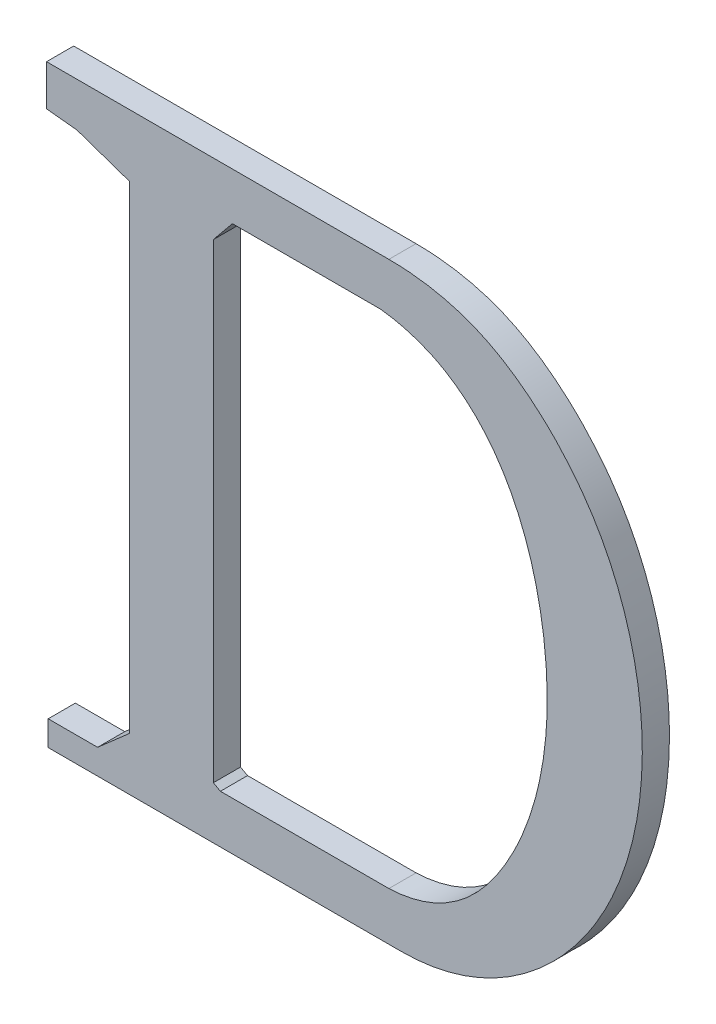
ISO-10303-21;
HEADER;
FILE_DESCRIPTION(('STEP AP214'),'2;1');
FILE_NAME('part.step','',(''),(''),'','','');
FILE_SCHEMA(('AUTOMOTIVE_DESIGN { 1 0 10303 214 1 1 1 1 }'));
ENDSEC;
DATA;
#1=APPLICATION_CONTEXT('core data for automotive mechanical design processes');
#2=APPLICATION_PROTOCOL_DEFINITION('international standard','automotive_design',2000,#1);
#3=PRODUCT_CONTEXT('',#1,'mechanical');
#4=PRODUCT('Part','Part','',(#3));
#5=PRODUCT_RELATED_PRODUCT_CATEGORY('part','',(#4));
#6=PRODUCT_DEFINITION_FORMATION('','',#4);
#7=PRODUCT_DEFINITION_CONTEXT('part definition',#1,'design');
#8=PRODUCT_DEFINITION('design','',#6,#7);
#9=PRODUCT_DEFINITION_SHAPE('','',#8);
#10=(LENGTH_UNIT() NAMED_UNIT(*) SI_UNIT(.MILLI.,.METRE.));
#11=(NAMED_UNIT(*) PLANE_ANGLE_UNIT() SI_UNIT($,.RADIAN.));
#12=(NAMED_UNIT(*) SI_UNIT($,.STERADIAN.) SOLID_ANGLE_UNIT());
#13=UNCERTAINTY_MEASURE_WITH_UNIT(LENGTH_MEASURE(1.E-05),#10,'distance_accuracy_value','');
#14=(GEOMETRIC_REPRESENTATION_CONTEXT(3) GLOBAL_UNCERTAINTY_ASSIGNED_CONTEXT((#13)) GLOBAL_UNIT_ASSIGNED_CONTEXT((#10,
#11,#12)) REPRESENTATION_CONTEXT('',''));
#15=CARTESIAN_POINT('',(0.,0.,0.));
#16=DIRECTION('',(0.,0.,1.));
#17=DIRECTION('',(1.,0.,0.));
#18=AXIS2_PLACEMENT_3D('',#15,#16,#17);
#19=CARTESIAN_POINT('',(0.,0.,0.05));
#20=DIRECTION('',(0.,0.,1.));
#21=DIRECTION('',(1.,0.,0.));
#22=AXIS2_PLACEMENT_3D('',#19,#20,#21);
#23=PLANE('',#22);
#24=DIRECTION('',(0.,1.,0.));
#25=VECTOR('',#24,1.);
#26=CARTESIAN_POINT('',(2.25679,-0.204724,0.05));
#27=LINE('',#26,#25);
#28=CARTESIAN_POINT('',(2.25679,0.661162,0.05));
#29=VERTEX_POINT('',#28);
#30=CARTESIAN_POINT('',(2.25679,-0.204724,0.05));
#31=VERTEX_POINT('',#30);
#32=EDGE_CURVE('E256',#29,#31,#27,.F.);
#33=ORIENTED_EDGE('',*,*,#32,.F.);
#34=DIRECTION('',(0.632488744875069,0.774569549883262,0.));
#35=VECTOR('',#34,1.);
#36=CARTESIAN_POINT('',(2.25679,0.661162,0.05));
#37=LINE('',#36,#35);
#38=CARTESIAN_POINT('',(2.291842,0.704088,0.05));
#39=VERTEX_POINT('',#38);
#40=EDGE_CURVE('E169',#39,#29,#37,.F.);
#41=ORIENTED_EDGE('',*,*,#40,.F.);
#42=DIRECTION('',(1.,0.,0.));
#43=VECTOR('',#42,1.);
#44=CARTESIAN_POINT('',(2.291842,0.704088,0.05));
#45=LINE('',#44,#43);
#46=CARTESIAN_POINT('',(2.56489199999966,0.704088000000059,0.05));
#47=VERTEX_POINT('',#46);
#48=EDGE_CURVE('E245',#47,#39,#45,.F.);
#49=ORIENTED_EDGE('',*,*,#48,.F.);
#50=CARTESIAN_POINT('',(2.579878,-0.211836000000042,0.05));
#51=CARTESIAN_POINT('',(2.59270405725341,-0.211378179546537,0.05));
#52=CARTESIAN_POINT('',(2.60551222075906,-0.209871885968661,0.05));
#53=CARTESIAN_POINT('',(2.63063931178318,-0.204755190453759,0.05));
#54=CARTESIAN_POINT('',(2.64296014726019,-0.201154094240938,0.05));
#55=CARTESIAN_POINT('',(2.66681818194975,-0.19182163463833,0.05));
#56=CARTESIAN_POINT('',(2.67835268512661,-0.186083339394163,0.05));
#57=CARTESIAN_POINT('',(2.70029341804385,-0.172779544921037,0.05));
#58=CARTESIAN_POINT('',(2.71069980557258,-0.165214301704397,0.05));
#59=CARTESIAN_POINT('',(2.73396801022546,-0.145543903185185,0.05));
#60=CARTESIAN_POINT('',(2.74628598550045,-0.132800404147166,0.05));
#61=CARTESIAN_POINT('',(2.76881776027124,-0.105526698379534,0.05));
#62=CARTESIAN_POINT('',(2.77902079535795,-0.0909879247064866,0.05));
#63=CARTESIAN_POINT('',(2.79616194184674,-0.0632656785516099,0.05));
#64=CARTESIAN_POINT('',(2.80336123893922,-0.0502397144528223,0.05));
#65=CARTESIAN_POINT('',(2.81667590375223,-0.0236421636391551,0.05));
#66=CARTESIAN_POINT('',(2.82279078288767,-0.0100703343457068,0.05));
#67=CARTESIAN_POINT('',(2.83943365306022,0.031273878432151,0.05));
#68=CARTESIAN_POINT('',(2.84829543356656,0.0597337911450507,0.05));
#69=CARTESIAN_POINT('',(2.86190337257059,0.118439893695758,0.05));
#70=CARTESIAN_POINT('',(2.86652497963052,0.148713877930418,0.05));
#71=CARTESIAN_POINT('',(2.87156741125946,0.209673996898516,0.05));
#72=CARTESIAN_POINT('',(2.87197793402499,0.240360958565274,0.05));
#73=CARTESIAN_POINT('',(2.86954013515845,0.289481838210722,0.05));
#74=CARTESIAN_POINT('',(2.86791022801706,0.307987207923261,0.05));
#75=CARTESIAN_POINT('',(2.8633194842924,0.344832646171001,0.05));
#76=CARTESIAN_POINT('',(2.86035800239188,0.363172630154654,0.05));
#77=CARTESIAN_POINT('',(2.84933386963922,0.417701102317451,0.05));
#78=CARTESIAN_POINT('',(2.83912581941203,0.453531529576088,0.05));
#79=CARTESIAN_POINT('',(2.81775955146486,0.50638321523503,0.05));
#80=CARTESIAN_POINT('',(2.80920744507614,0.524462622904349,0.05));
#81=CARTESIAN_POINT('',(2.7896303952468,0.559231499217572,0.05));
#82=CARTESIAN_POINT('',(2.77860984968366,0.575923368320503,0.05));
#83=CARTESIAN_POINT('',(2.7556710752392,0.604900256039021,0.05));
#84=CARTESIAN_POINT('',(2.74411978855582,0.617472760386937,0.05));
#85=CARTESIAN_POINT('',(2.71906691050355,0.640504672502657,0.05));
#86=CARTESIAN_POINT('',(2.70556699929959,0.650965882246984,0.05));
#87=CARTESIAN_POINT('',(2.67683844338449,0.669319736273249,0.05));
#88=CARTESIAN_POINT('',(2.66160290241437,0.677201615519794,0.05));
#89=CARTESIAN_POINT('',(2.62996215000533,0.690103802332504,0.05));
#90=CARTESIAN_POINT('',(2.61355674412275,0.695123632943444,0.05));
#91=CARTESIAN_POINT('',(2.59158863320416,0.69992417673529,0.05));
#92=CARTESIAN_POINT('',(2.58626941404877,0.700942055288227,0.05));
#93=CARTESIAN_POINT('',(2.57560292359691,0.702710547614795,0.05));
#94=CARTESIAN_POINT('',(2.57025578339688,0.703461949952957,0.05));
#95=CARTESIAN_POINT('',(2.56489199999923,0.704088000000115,0.05));
#96=B_SPLINE_CURVE_WITH_KNOTS('',3,(#50,#51,#52,#53,#54,#55,#56,#57,#58,#59,#60,#61,#62,#63,#64,
#65,#66,#67,#68,#69,#70,#71,#72,#73,#74,#75,#76,#77,#78,#79,#80,#81,#82,#83,#84,#85,#86,#87,#88,
#89,#90,#91,#92,#93,#94,#95),.UNSPECIFIED.,.F.,.F.,(4,2,2,2,2,2,2,2,2,2,2,2,2,2,2,2,2,2,2,2,2,2,
4),(0.,0.0384927831424705,0.0768158619811147,0.115264337089049,0.153707427491179,
0.206575510072063,0.259706403779363,0.304301583792309,0.348916805421521,0.437943573629923,
0.529508726595082,0.621297827085596,0.676979625728418,0.732688438415223,0.843708611321038,
0.903562853257194,0.963311292759999,1.01432243820239,1.06528986010274,1.11646736325322,
1.16765339255099,1.1838965895315,1.20009130997878),.UNSPECIFIED.);
#97=CARTESIAN_POINT('',(2.579878,-0.211836000000021,0.05));
#98=VERTEX_POINT('',#97);
#99=EDGE_CURVE('E201',#98,#47,#96,.T.);
#100=ORIENTED_EDGE('',*,*,#99,.F.);
#101=DIRECTION('',(1.,0.,0.));
#102=VECTOR('',#101,1.);
#103=CARTESIAN_POINT('',(2.579878,-0.211836,0.05));
#104=LINE('',#103,#102);
#105=CARTESIAN_POINT('',(2.269744,-0.211836,0.05));
#106=VERTEX_POINT('',#105);
#107=EDGE_CURVE('E242',#106,#98,#104,.T.);
#108=ORIENTED_EDGE('',*,*,#107,.F.);
#109=DIRECTION('',(-0.876578550779603,0.481258812192702,0.));
#110=VECTOR('',#109,1.);
#111=CARTESIAN_POINT('',(2.269744,-0.211836,0.05));
#112=LINE('',#111,#110);
#113=EDGE_CURVE('E262',#31,#106,#112,.F.);
#114=ORIENTED_EDGE('',*,*,#113,.F.);
#115=EDGE_LOOP('',(#33,#41,#49,#100,#108,#114));
#116=FACE_BOUND('',#115,.T.);
#117=DIRECTION('',(0.,1.,0.));
#118=VECTOR('',#117,1.);
#119=CARTESIAN_POINT('',(1.949704,0.79121,0.05));
#120=LINE('',#119,#118);
#121=CARTESIAN_POINT('',(1.949704,0.716026,0.05));
#122=VERTEX_POINT('',#121);
#123=CARTESIAN_POINT('',(1.949704,0.79121,0.05));
#124=VERTEX_POINT('',#123);
#125=EDGE_CURVE('E156',#122,#124,#120,.T.);
#126=ORIENTED_EDGE('',*,*,#125,.F.);
#127=DIRECTION('',(0.994628066608391,-0.103513328199099,0.));
#128=VECTOR('',#127,1.);
#129=CARTESIAN_POINT('',(1.949704,0.716026,0.05));
#130=LINE('',#129,#128);
#131=CARTESIAN_POINT('',(2.005838,0.710183999999999,0.05));
#132=VERTEX_POINT('',#131);
#133=EDGE_CURVE('E322',#132,#122,#130,.F.);
#134=ORIENTED_EDGE('',*,*,#133,.F.);
#135=DIRECTION('',(0.945100283555715,-0.326780437026005,0.));
#136=VECTOR('',#135,1.);
#137=CARTESIAN_POINT('',(2.005838,0.710184,0.05));
#138=LINE('',#137,#136);
#139=CARTESIAN_POINT('',(2.102866,0.676635335593207,0.05));
#140=VERTEX_POINT('',#139);
#141=EDGE_CURVE('E324',#140,#132,#138,.F.);
#142=ORIENTED_EDGE('',*,*,#141,.F.);
#143=DIRECTION('',(0.,1.,0.));
#144=VECTOR('',#143,1.);
#145=CARTESIAN_POINT('',(2.102866,0.6766353355932,0.05));
#146=LINE('',#145,#144);
#147=CARTESIAN_POINT('',(2.102866,-0.2028639384615,0.05));
#148=VERTEX_POINT('',#147);
#149=EDGE_CURVE('E347',#148,#140,#146,.T.);
#150=ORIENTED_EDGE('',*,*,#149,.F.);
#151=DIRECTION('',(-0.751859704857293,-0.659323125797894,0.));
#152=VECTOR('',#151,1.);
#153=CARTESIAN_POINT('',(2.102866,-0.2028639384615,0.05));
#154=LINE('',#153,#152);
#155=CARTESIAN_POINT('',(2.04368399999999,-0.254761999999992,0.05));
#156=VERTEX_POINT('',#155);
#157=EDGE_CURVE('E342',#156,#148,#154,.F.);
#158=ORIENTED_EDGE('',*,*,#157,.F.);
#159=DIRECTION('',(1.,0.,0.));
#160=VECTOR('',#159,1.);
#161=CARTESIAN_POINT('',(2.043684,-0.254762,0.05));
#162=LINE('',#161,#160);
#163=CARTESIAN_POINT('',(1.952752,-0.254762,0.05));
#164=VERTEX_POINT('',#163);
#165=EDGE_CURVE('E337',#164,#156,#162,.T.);
#166=ORIENTED_EDGE('',*,*,#165,.F.);
#167=DIRECTION('',(0.,1.,0.));
#168=VECTOR('',#167,1.);
#169=CARTESIAN_POINT('',(1.952752,-0.254762,0.05));
#170=LINE('',#169,#168);
#171=CARTESIAN_POINT('',(1.952752,-0.300736,0.05));
#172=VERTEX_POINT('',#171);
#173=EDGE_CURVE('E332',#172,#164,#170,.T.);
#174=ORIENTED_EDGE('',*,*,#173,.F.);
#175=DIRECTION('',(1.,0.,0.));
#176=VECTOR('',#175,1.);
#177=CARTESIAN_POINT('',(1.952752,-0.300736,0.05));
#178=LINE('',#177,#176);
#179=CARTESIAN_POINT('',(2.602738,-0.300735999999985,0.05));
#180=VERTEX_POINT('',#179);
#181=EDGE_CURVE('E131',#180,#172,#178,.F.);
#182=ORIENTED_EDGE('',*,*,#181,.F.);
#183=CARTESIAN_POINT('',(2.602738,-0.30073599999997,0.05));
#184=CARTESIAN_POINT('',(2.623562995287,-0.300761992288105,0.05));
#185=CARTESIAN_POINT('',(2.64436086946251,-0.298884113560386,0.05));
#186=CARTESIAN_POINT('',(2.68516838250024,-0.291607859565774,0.05));
#187=CARTESIAN_POINT('',(2.70518289958912,-0.286237022724266,0.05));
#188=CARTESIAN_POINT('',(2.74400737886422,-0.272263101091833,0.05));
#189=CARTESIAN_POINT('',(2.76281883053643,-0.263664107365345,0.05));
#190=CARTESIAN_POINT('',(2.7989623383027,-0.243726543156044,0.05));
#191=CARTESIAN_POINT('',(2.81629066500049,-0.232381326124191,0.05));
#192=CARTESIAN_POINT('',(2.85515606419696,-0.203032091320414,0.05));
#193=CARTESIAN_POINT('',(2.87599045632696,-0.184096241178142,0.05));
#194=CARTESIAN_POINT('',(2.91427686923892,-0.14307804316321,0.05));
#195=CARTESIAN_POINT('',(2.93172621216421,-0.120993227963387,0.05));
#196=CARTESIAN_POINT('',(2.96310547375458,-0.0742195368281475,0.05));
#197=CARTESIAN_POINT('',(2.97700805431244,-0.0495123962140172,0.05));
#198=CARTESIAN_POINT('',(3.00103705311622,0.00167925599964491,0.05));
#199=CARTESIAN_POINT('',(3.01116090978586,0.0281649589774403,0.05));
#200=CARTESIAN_POINT('',(3.02868525317362,0.0859043435674079,0.05));
#201=CARTESIAN_POINT('',(3.03554266232821,0.117322906383205,0.05));
#202=CARTESIAN_POINT('',(3.04450115407727,0.180862328737189,0.05));
#203=CARTESIAN_POINT('',(3.04659453165181,0.212984241250375,0.05));
#204=CARTESIAN_POINT('',(3.04607810686378,0.280870017238335,0.05));
#205=CARTESIAN_POINT('',(3.04290404049229,0.31663096905724,0.05));
#206=CARTESIAN_POINT('',(3.03081239101497,0.387123345976574,0.05));
#207=CARTESIAN_POINT('',(3.02190094971894,0.421855830503555,0.05));
#208=CARTESIAN_POINT('',(2.99782219850063,0.490250138933382,0.05));
#209=CARTESIAN_POINT('',(2.98248978076084,0.523856351051291,0.05));
#210=CARTESIAN_POINT('',(2.95455813984039,0.571361300337074,0.05));
#211=CARTESIAN_POINT('',(2.94440998248923,0.58672923078394,0.05));
#212=CARTESIAN_POINT('',(2.92258415593713,0.616342055123154,0.05));
#213=CARTESIAN_POINT('',(2.91090658164379,0.630587018613142,0.05));
#214=CARTESIAN_POINT('',(2.88983076696257,0.653794182272005,0.05));
#215=CARTESIAN_POINT('',(2.88077881888031,0.66307346564359,0.05));
#216=CARTESIAN_POINT('',(2.86205328393399,0.680973471179745,0.05));
#217=CARTESIAN_POINT('',(2.85237971462289,0.689594211924823,0.05));
#218=CARTESIAN_POINT('',(2.82246277122565,0.714237917896754,0.05));
#219=CARTESIAN_POINT('',(2.80123626266474,0.72914000212287,0.05));
#220=CARTESIAN_POINT('',(2.76923474532928,0.747173507405283,0.05));
#221=CARTESIAN_POINT('',(2.75947772028502,0.752142371188585,0.05));
#222=CARTESIAN_POINT('',(2.73954229709766,0.761148196098751,0.05));
#223=CARTESIAN_POINT('',(2.72936391333282,0.765185188993539,0.05));
#224=CARTESIAN_POINT('',(2.69833385418089,0.775927439323632,0.05));
#225=CARTESIAN_POINT('',(2.67699432402221,0.781260031948526,0.05));
#226=CARTESIAN_POINT('',(2.64290992911732,0.787057535272704,0.05));
#227=CARTESIAN_POINT('',(2.63033025949132,0.788626638654855,0.05));
#228=CARTESIAN_POINT('',(2.60512784802284,0.790698772849745,0.05));
#229=CARTESIAN_POINT('',(2.59250542025063,0.791205589351436,0.05));
#230=CARTESIAN_POINT('',(2.579878,0.791209999999999,0.05));
#231=B_SPLINE_CURVE_WITH_KNOTS('',3,(#183,#184,#185,#186,#187,#188,#189,#190,#191,#192,#193,
#194,#195,#196,#197,#198,#199,#200,#201,#202,#203,#204,#205,#206,#207,#208,#209,#210,#211,#212,
#213,#214,#215,#216,#217,#218,#219,#220,#221,#222,#223,#224,#225,#226,#227,#228,#229,#230),
.UNSPECIFIED.,.F.,.F.,(4,2,2,2,2,2,2,2,2,2,2,2,2,2,2,2,2,2,2,2,2,2,2,4),(0.,0.0623498409178476,
0.124213980088461,0.185999981651488,0.247937042862017,0.33196076441486,0.416050687091103,
0.500770414588374,0.585547469267111,0.681627848218424,0.777863510924983,0.885086681953342,
0.99219526193235,1.10224581160885,1.15740616369909,1.2125630944479,1.25141940087842,
1.29027461058914,1.36759605680743,1.40040465181357,1.43321212819383,1.49885095844088,
1.53684667323706,1.57470675024911),.UNSPECIFIED.);
#232=CARTESIAN_POINT('',(2.579878,0.791209999999999,0.05));
#233=VERTEX_POINT('',#232);
#234=EDGE_CURVE('E21',#180,#233,#231,.T.);
#235=ORIENTED_EDGE('',*,*,#234,.T.);
#236=DIRECTION('',(1.,0.,0.));
#237=VECTOR('',#236,1.);
#238=CARTESIAN_POINT('',(2.579878,0.79121,0.05));
#239=LINE('',#238,#237);
#240=EDGE_CURVE('E137',#124,#233,#239,.T.);
#241=ORIENTED_EDGE('',*,*,#240,.F.);
#242=EDGE_LOOP('',(#126,#134,#142,#150,#158,#166,#174,#182,#235,#241));
#243=FACE_BOUND('',#242,.T.);
#244=ADVANCED_FACE('F17',(#116,#243),#23,.T.);
#245=CARTESIAN_POINT('',(1.949704,0.716026,0.));
#246=DIRECTION('',(-0.103513328199099,-0.994628066608391,0.));
#247=DIRECTION('',(0.994628066608391,-0.103513328199099,0.));
#248=AXIS2_PLACEMENT_3D('',#245,#246,#247);
#249=PLANE('',#248);
#250=DIRECTION('',(0.,0.,1.));
#251=VECTOR('',#250,1.);
#252=CARTESIAN_POINT('',(1.949704,0.716026,0.));
#253=LINE('',#252,#251);
#254=CARTESIAN_POINT('',(1.949704,0.716026,0.));
#255=VERTEX_POINT('',#254);
#256=EDGE_CURVE('E153',#255,#122,#253,.T.);
#257=ORIENTED_EDGE('',*,*,#256,.F.);
#258=DIRECTION('',(0.994628066608395,-0.103513328199063,0.));
#259=VECTOR('',#258,1.);
#260=CARTESIAN_POINT('',(1.949704,0.716026,0.));
#261=LINE('',#260,#259);
#262=CARTESIAN_POINT('',(2.005838,0.710184,0.));
#263=VERTEX_POINT('',#262);
#264=EDGE_CURVE('E304',#255,#263,#261,.T.);
#265=ORIENTED_EDGE('',*,*,#264,.T.);
#266=DIRECTION('',(0.,0.,1.));
#267=VECTOR('',#266,1.);
#268=CARTESIAN_POINT('',(2.005838,0.710184,0.));
#269=LINE('',#268,#267);
#270=EDGE_CURVE('E349',#132,#263,#269,.F.);
#271=ORIENTED_EDGE('',*,*,#270,.F.);
#272=ORIENTED_EDGE('',*,*,#133,.T.);
#273=EDGE_LOOP('',(#257,#265,#271,#272));
#274=FACE_BOUND('',#273,.T.);
#275=ADVANCED_FACE('F381',(#274),#249,.T.);
#276=CARTESIAN_POINT('',(2.005838,0.710184,0.));
#277=DIRECTION('',(-0.326780437026005,-0.945100283555715,0.));
#278=DIRECTION('',(0.945100283555715,-0.326780437026005,0.));
#279=AXIS2_PLACEMENT_3D('',#276,#277,#278);
#280=PLANE('',#279);
#281=ORIENTED_EDGE('',*,*,#270,.T.);
#282=DIRECTION('',(0.945100283555642,-0.326780437026217,0.));
#283=VECTOR('',#282,1.);
#284=CARTESIAN_POINT('',(2.005838,0.710184,0.));
#285=LINE('',#284,#283);
#286=CARTESIAN_POINT('',(2.102866,0.6766353355932,0.));
#287=VERTEX_POINT('',#286);
#288=EDGE_CURVE('E307',#263,#287,#285,.T.);
#289=ORIENTED_EDGE('',*,*,#288,.T.);
#290=DIRECTION('',(0.,0.,1.));
#291=VECTOR('',#290,1.);
#292=CARTESIAN_POINT('',(2.102866,0.6766353355932,0.));
#293=LINE('',#292,#291);
#294=EDGE_CURVE('E344',#140,#287,#293,.F.);
#295=ORIENTED_EDGE('',*,*,#294,.F.);
#296=ORIENTED_EDGE('',*,*,#141,.T.);
#297=EDGE_LOOP('',(#281,#289,#295,#296));
#298=FACE_BOUND('',#297,.T.);
#299=ADVANCED_FACE('F386',(#298),#280,.T.);
#300=CARTESIAN_POINT('',(2.102866,0.6766353355932,0.));
#301=DIRECTION('',(-1.,0.,0.));
#302=DIRECTION('',(0.,0.,1.));
#303=AXIS2_PLACEMENT_3D('',#300,#301,#302);
#304=PLANE('',#303);
#305=ORIENTED_EDGE('',*,*,#294,.T.);
#306=DIRECTION('',(0.,1.,0.));
#307=VECTOR('',#306,1.);
#308=CARTESIAN_POINT('',(2.102866,0.,0.));
#309=LINE('',#308,#307);
#310=CARTESIAN_POINT('',(2.102866,-0.2028639384615,0.));
#311=VERTEX_POINT('',#310);
#312=EDGE_CURVE('E428',#287,#311,#309,.F.);
#313=ORIENTED_EDGE('',*,*,#312,.T.);
#314=DIRECTION('',(0.,0.,1.));
#315=VECTOR('',#314,1.);
#316=CARTESIAN_POINT('',(2.102866,-0.2028639384615,0.));
#317=LINE('',#316,#315);
#318=EDGE_CURVE('E339',#148,#311,#317,.F.);
#319=ORIENTED_EDGE('',*,*,#318,.F.);
#320=ORIENTED_EDGE('',*,*,#149,.T.);
#321=EDGE_LOOP('',(#305,#313,#319,#320));
#322=FACE_BOUND('',#321,.T.);
#323=ADVANCED_FACE('F391',(#322),#304,.T.);
#324=CARTESIAN_POINT('',(2.102866,-0.2028639384615,0.));
#325=DIRECTION('',(-0.659323125797894,0.751859704857293,0.));
#326=DIRECTION('',(-0.751859704857293,-0.659323125797894,0.));
#327=AXIS2_PLACEMENT_3D('',#324,#325,#326);
#328=PLANE('',#327);
#329=ORIENTED_EDGE('',*,*,#318,.T.);
#330=DIRECTION('',(-0.751859704857031,-0.659323125798192,0.));
#331=VECTOR('',#330,1.);
#332=CARTESIAN_POINT('',(2.102866,-0.2028639384615,0.));
#333=LINE('',#332,#331);
#334=CARTESIAN_POINT('',(2.043684,-0.254762,0.));
#335=VERTEX_POINT('',#334);
#336=EDGE_CURVE('E426',#311,#335,#333,.T.);
#337=ORIENTED_EDGE('',*,*,#336,.T.);
#338=DIRECTION('',(0.,0.,1.));
#339=VECTOR('',#338,1.);
#340=CARTESIAN_POINT('',(2.043684,-0.254762,0.));
#341=LINE('',#340,#339);
#342=EDGE_CURVE('E334',#156,#335,#341,.F.);
#343=ORIENTED_EDGE('',*,*,#342,.F.);
#344=ORIENTED_EDGE('',*,*,#157,.T.);
#345=EDGE_LOOP('',(#329,#337,#343,#344));
#346=FACE_BOUND('',#345,.T.);
#347=ADVANCED_FACE('F397',(#346),#328,.T.);
#348=CARTESIAN_POINT('',(2.043684,-0.254762,0.));
#349=DIRECTION('',(0.,1.,0.));
#350=DIRECTION('',(0.,0.,1.));
#351=AXIS2_PLACEMENT_3D('',#348,#349,#350);
#352=PLANE('',#351);
#353=ORIENTED_EDGE('',*,*,#342,.T.);
#354=DIRECTION('',(1.,0.,0.));
#355=VECTOR('',#354,1.);
#356=CARTESIAN_POINT('',(0.,-0.254762,0.));
#357=LINE('',#356,#355);
#358=CARTESIAN_POINT('',(1.952752,-0.254762,0.));
#359=VERTEX_POINT('',#358);
#360=EDGE_CURVE('E422',#335,#359,#357,.F.);
#361=ORIENTED_EDGE('',*,*,#360,.T.);
#362=DIRECTION('',(0.,0.,1.));
#363=VECTOR('',#362,1.);
#364=CARTESIAN_POINT('',(1.952752,-0.254762,0.));
#365=LINE('',#364,#363);
#366=EDGE_CURVE('E329',#164,#359,#365,.F.);
#367=ORIENTED_EDGE('',*,*,#366,.F.);
#368=ORIENTED_EDGE('',*,*,#165,.T.);
#369=EDGE_LOOP('',(#353,#361,#367,#368));
#370=FACE_BOUND('',#369,.T.);
#371=ADVANCED_FACE('F401',(#370),#352,.T.);
#372=CARTESIAN_POINT('',(1.952752,-0.254762,0.));
#373=DIRECTION('',(-1.,0.,0.));
#374=DIRECTION('',(0.,0.,1.));
#375=AXIS2_PLACEMENT_3D('',#372,#373,#374);
#376=PLANE('',#375);
#377=ORIENTED_EDGE('',*,*,#366,.T.);
#378=DIRECTION('',(0.,1.,0.));
#379=VECTOR('',#378,1.);
#380=CARTESIAN_POINT('',(1.952752,0.,0.));
#381=LINE('',#380,#379);
#382=CARTESIAN_POINT('',(1.952752,-0.300736,0.));
#383=VERTEX_POINT('',#382);
#384=EDGE_CURVE('E278',#359,#383,#381,.F.);
#385=ORIENTED_EDGE('',*,*,#384,.T.);
#386=DIRECTION('',(0.,0.,-1.));
#387=VECTOR('',#386,1.);
#388=CARTESIAN_POINT('',(1.952752,-0.300736,0.));
#389=LINE('',#388,#387);
#390=EDGE_CURVE('E328',#172,#383,#389,.T.);
#391=ORIENTED_EDGE('',*,*,#390,.F.);
#392=ORIENTED_EDGE('',*,*,#173,.T.);
#393=EDGE_LOOP('',(#377,#385,#391,#392));
#394=FACE_BOUND('',#393,.T.);
#395=ADVANCED_FACE('F404',(#394),#376,.T.);
#396=CARTESIAN_POINT('',(1.952752,-0.300736,0.));
#397=DIRECTION('',(0.,-1.,0.));
#398=DIRECTION('',(0.,0.,-1.));
#399=AXIS2_PLACEMENT_3D('',#396,#397,#398);
#400=PLANE('',#399);
#401=ORIENTED_EDGE('',*,*,#390,.T.);
#402=DIRECTION('',(1.,0.,0.));
#403=VECTOR('',#402,1.);
#404=CARTESIAN_POINT('',(0.,-0.300736,0.));
#405=LINE('',#404,#403);
#406=CARTESIAN_POINT('',(2.602738,-0.300735999999977,0.));
#407=VERTEX_POINT('',#406);
#408=EDGE_CURVE('E194',#383,#407,#405,.T.);
#409=ORIENTED_EDGE('',*,*,#408,.T.);
#410=DIRECTION('',(0.,0.,1.));
#411=VECTOR('',#410,1.);
#412=CARTESIAN_POINT('',(2.602738,-0.30073599999997,0.));
#413=LINE('',#412,#411);
#414=EDGE_CURVE('E148',#407,#180,#413,.T.);
#415=ORIENTED_EDGE('',*,*,#414,.T.);
#416=ORIENTED_EDGE('',*,*,#181,.T.);
#417=EDGE_LOOP('',(#401,#409,#415,#416));
#418=FACE_BOUND('',#417,.T.);
#419=ADVANCED_FACE('F184',(#418),#400,.T.);
#420=CARTESIAN_POINT('',(2.563600256031,0.7909274938287,0.));
#421=CARTESIAN_POINT('',(2.569009751459,0.7911151358717,0.));
#422=CARTESIAN_POINT('',(2.629956089126,0.7921802708482,0.));
#423=CARTESIAN_POINT('',(2.742122370668,0.7726208138962,0.));
#424=CARTESIAN_POINT('',(2.868991411445,0.6831483167667,0.));
#425=CARTESIAN_POINT('',(2.963318459562,0.5695286888572,0.));
#426=CARTESIAN_POINT('',(3.05516811917,0.362259632217,0.));
#427=CARTESIAN_POINT('',(3.056840745886,0.08546039766513,0.));
#428=CARTESIAN_POINT('',(2.92079368559,-0.1584025326122,0.));
#429=CARTESIAN_POINT('',(2.761453162091,-0.27711959233,0.));
#430=CARTESIAN_POINT('',(2.646505704743,-0.3018754928401,0.));
#431=CARTESIAN_POINT('',(2.59183050822,-0.300609523806,0.));
#432=CARTESIAN_POINT('',(2.586353865715,-0.3003540514151,0.));
#433=(BOUNDED_CURVE() B_SPLINE_CURVE(3,(#420,#421,#422,#423,#424,#425,#426,#427,#428,#429,#430,
#431,#432),.UNSPECIFIED.,.F.,.F.) B_SPLINE_CURVE_WITH_KNOTS((4,1,1,1,1,1,1,1,1,1,4),(0.,
0.01022770246743,0.114836701946,0.2061777971496,0.2965039776165,0.3894037320217,0.6288040813657,
0.7825256805617,0.8998029010564,0.9899898438431,1.),
.UNSPECIFIED.) CURVE() GEOMETRIC_REPRESENTATION_ITEM() RATIONAL_B_SPLINE_CURVE((1.,1.,1.,1.,1.,
1.,1.,1.,1.,1.,1.,1.,1.)) REPRESENTATION_ITEM(''));
#434=DIRECTION('',(0.,0.,1.));
#435=VECTOR('',#434,1.);
#436=SURFACE_OF_LINEAR_EXTRUSION('',#433,#435);
#437=ORIENTED_EDGE('',*,*,#234,.F.);
#438=ORIENTED_EDGE('',*,*,#414,.F.);
#439=CARTESIAN_POINT('',(2.602738,-0.30073599999997,0.));
#440=CARTESIAN_POINT('',(2.623562995287,-0.300761992288105,0.));
#441=CARTESIAN_POINT('',(2.64436086946251,-0.298884113560386,0.));
#442=CARTESIAN_POINT('',(2.68516838250024,-0.291607859565774,0.));
#443=CARTESIAN_POINT('',(2.70518289958912,-0.286237022724266,0.));
#444=CARTESIAN_POINT('',(2.74400737886422,-0.272263101091833,0.));
#445=CARTESIAN_POINT('',(2.76281883053643,-0.263664107365345,0.));
#446=CARTESIAN_POINT('',(2.7989623383027,-0.243726543156044,0.));
#447=CARTESIAN_POINT('',(2.81629066500049,-0.232381326124191,0.));
#448=CARTESIAN_POINT('',(2.85515606419696,-0.203032091320414,0.));
#449=CARTESIAN_POINT('',(2.87599045632696,-0.184096241178142,0.));
#450=CARTESIAN_POINT('',(2.91427686923892,-0.14307804316321,0.));
#451=CARTESIAN_POINT('',(2.93172621216421,-0.120993227963387,0.));
#452=CARTESIAN_POINT('',(2.96310547375458,-0.0742195368281475,0.));
#453=CARTESIAN_POINT('',(2.97700805431244,-0.0495123962140172,0.));
#454=CARTESIAN_POINT('',(3.00103705311622,0.00167925599964491,0.));
#455=CARTESIAN_POINT('',(3.01116090978586,0.0281649589774403,0.));
#456=CARTESIAN_POINT('',(3.02868525317362,0.0859043435674079,0.));
#457=CARTESIAN_POINT('',(3.03554266232821,0.117322906383205,0.));
#458=CARTESIAN_POINT('',(3.04450115407727,0.180862328737189,0.));
#459=CARTESIAN_POINT('',(3.04659453165181,0.212984241250375,0.));
#460=CARTESIAN_POINT('',(3.04607810686378,0.280870017238335,0.));
#461=CARTESIAN_POINT('',(3.04290404049229,0.31663096905724,0.));
#462=CARTESIAN_POINT('',(3.03081239101497,0.387123345976574,0.));
#463=CARTESIAN_POINT('',(3.02190094971894,0.421855830503555,0.));
#464=CARTESIAN_POINT('',(2.99782219850063,0.490250138933382,0.));
#465=CARTESIAN_POINT('',(2.98248978076084,0.523856351051291,0.));
#466=CARTESIAN_POINT('',(2.95455813984039,0.571361300337074,0.));
#467=CARTESIAN_POINT('',(2.94440998248923,0.58672923078394,0.));
#468=CARTESIAN_POINT('',(2.92258415593713,0.616342055123154,0.));
#469=CARTESIAN_POINT('',(2.91090658164379,0.630587018613142,0.));
#470=CARTESIAN_POINT('',(2.88983076696257,0.653794182272005,0.));
#471=CARTESIAN_POINT('',(2.88077881888031,0.66307346564359,0.));
#472=CARTESIAN_POINT('',(2.86205328393399,0.680973471179745,0.));
#473=CARTESIAN_POINT('',(2.85237971462289,0.689594211924823,0.));
#474=CARTESIAN_POINT('',(2.82246277122565,0.714237917896754,0.));
#475=CARTESIAN_POINT('',(2.80123626266474,0.72914000212287,0.));
#476=CARTESIAN_POINT('',(2.76923474532928,0.747173507405283,0.));
#477=CARTESIAN_POINT('',(2.75947772028502,0.752142371188585,0.));
#478=CARTESIAN_POINT('',(2.73954229709766,0.761148196098751,0.));
#479=CARTESIAN_POINT('',(2.72936391333282,0.765185188993539,0.));
#480=CARTESIAN_POINT('',(2.69833385418089,0.775927439323632,0.));
#481=CARTESIAN_POINT('',(2.67699432402221,0.781260031948526,0.));
#482=CARTESIAN_POINT('',(2.64290992911732,0.787057535272704,0.));
#483=CARTESIAN_POINT('',(2.63033025949132,0.788626638654855,0.));
#484=CARTESIAN_POINT('',(2.60512784802284,0.790698772849745,0.));
#485=CARTESIAN_POINT('',(2.59250542025063,0.791205589351436,0.));
#486=CARTESIAN_POINT('',(2.579878,0.791209999999999,0.));
#487=B_SPLINE_CURVE_WITH_KNOTS('',3,(#439,#440,#441,#442,#443,#444,#445,#446,#447,#448,#449,
#450,#451,#452,#453,#454,#455,#456,#457,#458,#459,#460,#461,#462,#463,#464,#465,#466,#467,#468,
#469,#470,#471,#472,#473,#474,#475,#476,#477,#478,#479,#480,#481,#482,#483,#484,#485,#486),
.UNSPECIFIED.,.F.,.F.,(4,2,2,2,2,2,2,2,2,2,2,2,2,2,2,2,2,2,2,2,2,2,2,4),(0.,0.0623498409178476,
0.124213980088461,0.185999981651488,0.247937042862017,0.33196076441486,0.416050687091103,
0.500770414588374,0.585547469267111,0.681627848218424,0.777863510924983,0.885086681953342,
0.99219526193235,1.10224581160885,1.15740616369909,1.2125630944479,1.25141940087842,
1.29027461058914,1.36759605680743,1.40040465181357,1.43321212819383,1.49885095844088,
1.53684667323706,1.57470675024911),.UNSPECIFIED.);
#488=CARTESIAN_POINT('',(2.579878,0.79121,0.));
#489=VERTEX_POINT('',#488);
#490=EDGE_CURVE('E152',#407,#489,#487,.T.);
#491=ORIENTED_EDGE('',*,*,#490,.T.);
#492=DIRECTION('',(0.,0.,1.));
#493=VECTOR('',#492,1.);
#494=CARTESIAN_POINT('',(2.579878,0.79121,0.));
#495=LINE('',#494,#493);
#496=EDGE_CURVE('E141',#233,#489,#495,.F.);
#497=ORIENTED_EDGE('',*,*,#496,.F.);
#498=EDGE_LOOP('',(#437,#438,#491,#497));
#499=FACE_BOUND('',#498,.T.);
#500=ADVANCED_FACE('F150',(#499),#436,.F.);
#501=CARTESIAN_POINT('',(2.579878,0.79121,0.));
#502=DIRECTION('',(0.,1.,0.));
#503=DIRECTION('',(0.,0.,1.));
#504=AXIS2_PLACEMENT_3D('',#501,#502,#503);
#505=PLANE('',#504);
#506=ORIENTED_EDGE('',*,*,#496,.T.);
#507=DIRECTION('',(1.,0.,0.));
#508=VECTOR('',#507,1.);
#509=CARTESIAN_POINT('',(0.,0.79121,0.));
#510=LINE('',#509,#508);
#511=CARTESIAN_POINT('',(1.949704,0.79121,0.));
#512=VERTEX_POINT('',#511);
#513=EDGE_CURVE('E165',#489,#512,#510,.F.);
#514=ORIENTED_EDGE('',*,*,#513,.T.);
#515=DIRECTION('',(0.,0.,1.));
#516=VECTOR('',#515,1.);
#517=CARTESIAN_POINT('',(1.949704,0.79121,0.));
#518=LINE('',#517,#516);
#519=EDGE_CURVE('E143',#124,#512,#518,.F.);
#520=ORIENTED_EDGE('',*,*,#519,.F.);
#521=ORIENTED_EDGE('',*,*,#240,.T.);
#522=EDGE_LOOP('',(#506,#514,#520,#521));
#523=FACE_BOUND('',#522,.T.);
#524=ADVANCED_FACE('F138',(#523),#505,.T.);
#525=CARTESIAN_POINT('',(1.949704,0.79121,0.));
#526=DIRECTION('',(-1.,0.,0.));
#527=DIRECTION('',(0.,0.,1.));
#528=AXIS2_PLACEMENT_3D('',#525,#526,#527);
#529=PLANE('',#528);
#530=ORIENTED_EDGE('',*,*,#519,.T.);
#531=DIRECTION('',(0.,1.,0.));
#532=VECTOR('',#531,1.);
#533=CARTESIAN_POINT('',(1.949704,0.,0.));
#534=LINE('',#533,#532);
#535=EDGE_CURVE('E161',#512,#255,#534,.F.);
#536=ORIENTED_EDGE('',*,*,#535,.T.);
#537=ORIENTED_EDGE('',*,*,#256,.T.);
#538=ORIENTED_EDGE('',*,*,#125,.T.);
#539=EDGE_LOOP('',(#530,#536,#537,#538));
#540=FACE_BOUND('',#539,.T.);
#541=ADVANCED_FACE('F452',(#540),#529,.T.);
#542=CARTESIAN_POINT('',(2.25679,0.661162,0.));
#543=DIRECTION('',(0.774569549883262,-0.632488744875069,0.));
#544=DIRECTION('',(0.632488744875069,0.774569549883262,0.));
#545=AXIS2_PLACEMENT_3D('',#542,#543,#544);
#546=PLANE('',#545);
#547=DIRECTION('',(0.,0.,-1.));
#548=VECTOR('',#547,1.);
#549=CARTESIAN_POINT('',(2.25679,0.661162,0.));
#550=LINE('',#549,#548);
#551=CARTESIAN_POINT('',(2.25679,0.661162,0.));
#552=VERTEX_POINT('',#551);
#553=EDGE_CURVE('E253',#552,#29,#550,.F.);
#554=ORIENTED_EDGE('',*,*,#553,.F.);
#555=DIRECTION('',(0.63248874487508,0.774569549883254,0.));
#556=VECTOR('',#555,1.);
#557=CARTESIAN_POINT('',(2.25679,0.661162,0.));
#558=LINE('',#557,#556);
#559=CARTESIAN_POINT('',(2.291842,0.704088,0.));
#560=VERTEX_POINT('',#559);
#561=EDGE_CURVE('E164',#552,#560,#558,.T.);
#562=ORIENTED_EDGE('',*,*,#561,.T.);
#563=DIRECTION('',(0.,0.,-1.));
#564=VECTOR('',#563,1.);
#565=CARTESIAN_POINT('',(2.291842,0.704088,0.));
#566=LINE('',#565,#564);
#567=EDGE_CURVE('E243',#39,#560,#566,.T.);
#568=ORIENTED_EDGE('',*,*,#567,.F.);
#569=ORIENTED_EDGE('',*,*,#40,.T.);
#570=EDGE_LOOP('',(#554,#562,#568,#569));
#571=FACE_BOUND('',#570,.T.);
#572=ADVANCED_FACE('F301',(#571),#546,.T.);
#573=CARTESIAN_POINT('',(2.291842,0.704088,0.));
#574=DIRECTION('',(0.,-1.,0.));
#575=DIRECTION('',(0.,0.,-1.));
#576=AXIS2_PLACEMENT_3D('',#573,#574,#575);
#577=PLANE('',#576);
#578=ORIENTED_EDGE('',*,*,#567,.T.);
#579=DIRECTION('',(1.,0.,0.));
#580=VECTOR('',#579,1.);
#581=CARTESIAN_POINT('',(0.,0.704088,0.));
#582=LINE('',#581,#580);
#583=CARTESIAN_POINT('',(2.56489199999977,0.704088000000045,0.));
#584=VERTEX_POINT('',#583);
#585=EDGE_CURVE('E250',#560,#584,#582,.T.);
#586=ORIENTED_EDGE('',*,*,#585,.T.);
#587=DIRECTION('',(0.,0.,1.));
#588=VECTOR('',#587,1.);
#589=CARTESIAN_POINT('',(2.564892,0.704088000000025,0.));
#590=LINE('',#589,#588);
#591=EDGE_CURVE('E237',#47,#584,#590,.F.);
#592=ORIENTED_EDGE('',*,*,#591,.F.);
#593=ORIENTED_EDGE('',*,*,#48,.T.);
#594=EDGE_LOOP('',(#578,#586,#592,#593));
#595=FACE_BOUND('',#594,.T.);
#596=ADVANCED_FACE('F226',(#595),#577,.T.);
#597=CARTESIAN_POINT('',(2.548804833432,0.705588685269,0.));
#598=CARTESIAN_POINT('',(2.554249101472,0.705205141334,0.));
#599=CARTESIAN_POINT('',(2.635893952844,0.6975726151923,0.));
#600=CARTESIAN_POINT('',(2.790118434476,0.6135929366101,0.));
#601=CARTESIAN_POINT('',(2.896704053377,0.3065065104579,0.));
#602=CARTESIAN_POINT('',(2.859965868898,0.02910826497169,0.));
#603=CARTESIAN_POINT('',(2.733474969975,-0.1606938358078,0.));
#604=CARTESIAN_POINT('',(2.645312687245,-0.2115354737056,0.));
#605=CARTESIAN_POINT('',(2.568826108367,-0.2120895894346,0.));
#606=CARTESIAN_POINT('',(2.563145159711,-0.2119499241744,0.));
#607=(BOUNDED_CURVE() B_SPLINE_CURVE(3,(#597,#598,#599,#600,#601,#602,#603,#604,#605,#606),
.UNSPECIFIED.,.F.,.F.) B_SPLINE_CURVE_WITH_KNOTS((4,1,1,1,1,1,1,4),(0.,0.01156217335232,
0.1760499335797,0.4322751848677,0.7515263165266,0.8384552784395,0.9882212220809,1.),
.UNSPECIFIED.) CURVE() GEOMETRIC_REPRESENTATION_ITEM() RATIONAL_B_SPLINE_CURVE((1.,1.,1.,1.,1.,
1.,1.,1.,1.,1.)) REPRESENTATION_ITEM(''));
#608=DIRECTION('',(0.,0.,1.));
#609=VECTOR('',#608,1.);
#610=SURFACE_OF_LINEAR_EXTRUSION('',#607,#609);
#611=ORIENTED_EDGE('',*,*,#591,.T.);
#612=CARTESIAN_POINT('',(2.56489199999954,0.704088000000078,0.));
#613=CARTESIAN_POINT('',(2.57435521867747,0.702984600815658,0.));
#614=CARTESIAN_POINT('',(2.58377161207562,0.701486705548734,0.));
#615=CARTESIAN_POINT('',(2.60244136827194,0.697649028021419,0.));
#616=CARTESIAN_POINT('',(2.61169453401768,0.695308292684206,0.));
#617=CARTESIAN_POINT('',(2.63894239571455,0.686987104884193,0.));
#618=CARTESIAN_POINT('',(2.65656295905939,0.679693276999943,0.));
#619=CARTESIAN_POINT('',(2.68822268814633,0.662626759283406,0.));
#620=CARTESIAN_POINT('',(2.70244379262841,0.653187443113614,0.));
#621=CARTESIAN_POINT('',(2.72901222507054,0.631991010635087,0.));
#622=CARTESIAN_POINT('',(2.74136025368385,0.620234764812466,0.));
#623=CARTESIAN_POINT('',(2.76694240842869,0.591756037564466,0.));
#624=CARTESIAN_POINT('',(2.77961083576646,0.574529511903527,0.));
#625=CARTESIAN_POINT('',(2.80205265315446,0.538264849733155,0.));
#626=CARTESIAN_POINT('',(2.81181640595032,0.519220953481366,0.));
#627=CARTESIAN_POINT('',(2.83364352660827,0.468928345275374,0.));
#628=CARTESIAN_POINT('',(2.84386903103459,0.436884910748216,0.));
#629=CARTESIAN_POINT('',(2.85551556392782,0.388003332878612,0.));
#630=CARTESIAN_POINT('',(2.85878459723299,0.371547802813445,0.));
#631=CARTESIAN_POINT('',(2.86420951235792,0.338453544101065,0.));
#632=CARTESIAN_POINT('',(2.86636555200522,0.321814841770462,0.));
#633=CARTESIAN_POINT('',(2.87139634868352,0.269358098801663,0.));
#634=CARTESIAN_POINT('',(2.87228312321941,0.233323106747514,0.));
#635=CARTESIAN_POINT('',(2.86832705686105,0.161643775484517,0.));
#636=CARTESIAN_POINT('',(2.86350079922184,0.125998607236157,0.));
#637=CARTESIAN_POINT('',(2.84924214648149,0.0633285935186516,0.));
#638=CARTESIAN_POINT('',(2.84096800973799,0.0360448339664802,0.));
#639=CARTESIAN_POINT('',(2.82549492567356,-0.00368748200931688,0.));
#640=CARTESIAN_POINT('',(2.81982136929024,-0.0167422870227152,0.));
#641=CARTESIAN_POINT('',(2.80747709284909,-0.0423693409936732,0.));
#642=CARTESIAN_POINT('',(2.8008066665752,-0.054941730754787,0.));
#643=CARTESIAN_POINT('',(2.78502337325897,-0.0817639581430403,0.));
#644=CARTESIAN_POINT('',(2.77568708018428,-0.0958851125559579,0.));
#645=CARTESIAN_POINT('',(2.7551469386457,-0.122669028939488,0.));
#646=CARTESIAN_POINT('',(2.74394949597767,-0.135336549629431,0.));
#647=CARTESIAN_POINT('',(2.72200546593942,-0.156070438852218,0.));
#648=CARTESIAN_POINT('',(2.71165024732627,-0.164545687807762,0.));
#649=CARTESIAN_POINT('',(2.68967037984825,-0.179657850749668,0.));
#650=CARTESIAN_POINT('',(2.67804666820303,-0.186296109335685,0.));
#651=CARTESIAN_POINT('',(2.65248759222777,-0.197935780648045,0.));
#652=CARTESIAN_POINT('',(2.6384377057942,-0.202691002985879,0.));
#653=CARTESIAN_POINT('',(2.61682526739785,-0.207690352708395,0.));
#654=CARTESIAN_POINT('',(2.60949037114754,-0.209002420312947,0.));
#655=CARTESIAN_POINT('',(2.59473408574335,-0.210930730326348,0.));
#656=CARTESIAN_POINT('',(2.58731275953842,-0.211547450625601,0.));
#657=CARTESIAN_POINT('',(2.57987799999877,-0.21183600000009,0.));
#658=B_SPLINE_CURVE_WITH_KNOTS('',3,(#612,#613,#614,#615,#616,#617,#618,#619,#620,#621,#622,
#623,#624,#625,#626,#627,#628,#629,#630,#631,#632,#633,#634,#635,#636,#637,#638,#639,#640,#641,
#642,#643,#644,#645,#646,#647,#648,#649,#650,#651,#652,#653,#654,#655,#656,#657),.UNSPECIFIED.,
.F.,.F.,(4,2,2,2,2,2,2,2,2,2,2,2,2,2,2,2,2,2,2,2,2,2,4),(0.,0.0285688756969314,
0.0571701588294217,0.113964453923946,0.164899372623786,0.215815191087144,0.279607929541102,
0.343610020419942,0.443921761909944,0.494230584778491,0.544532271666789,0.652241734253249,
0.759639313023449,0.844838326083417,0.887503557415702,0.930156239736282,0.980823217182208,
1.03131928674264,1.07130377011527,1.11125890864632,1.15542428382244,1.17774975955446,
1.20005988231625),.UNSPECIFIED.);
#659=CARTESIAN_POINT('',(2.579878,-0.211836,0.));
#660=VERTEX_POINT('',#659);
#661=EDGE_CURVE('E195',#584,#660,#658,.T.);
#662=ORIENTED_EDGE('',*,*,#661,.T.);
#663=DIRECTION('',(0.,0.,1.));
#664=VECTOR('',#663,1.);
#665=CARTESIAN_POINT('',(2.579878,-0.211836,0.));
#666=LINE('',#665,#664);
#667=EDGE_CURVE('E266',#98,#660,#666,.F.);
#668=ORIENTED_EDGE('',*,*,#667,.F.);
#669=ORIENTED_EDGE('',*,*,#99,.T.);
#670=EDGE_LOOP('',(#611,#662,#668,#669));
#671=FACE_BOUND('',#670,.T.);
#672=ADVANCED_FACE('F220',(#671),#610,.T.);
#673=CARTESIAN_POINT('',(2.579878,-0.211836,0.));
#674=DIRECTION('',(0.,1.,0.));
#675=DIRECTION('',(0.,0.,1.));
#676=AXIS2_PLACEMENT_3D('',#673,#674,#675);
#677=PLANE('',#676);
#678=ORIENTED_EDGE('',*,*,#667,.T.);
#679=DIRECTION('',(1.,0.,0.));
#680=VECTOR('',#679,1.);
#681=CARTESIAN_POINT('',(0.,-0.211836,0.));
#682=LINE('',#681,#680);
#683=CARTESIAN_POINT('',(2.269744,-0.211835999999999,0.));
#684=VERTEX_POINT('',#683);
#685=EDGE_CURVE('E272',#660,#684,#682,.F.);
#686=ORIENTED_EDGE('',*,*,#685,.T.);
#687=DIRECTION('',(0.,0.,1.));
#688=VECTOR('',#687,1.);
#689=CARTESIAN_POINT('',(2.269744,-0.211836,0.));
#690=LINE('',#689,#688);
#691=EDGE_CURVE('E257',#106,#684,#690,.F.);
#692=ORIENTED_EDGE('',*,*,#691,.F.);
#693=ORIENTED_EDGE('',*,*,#107,.T.);
#694=EDGE_LOOP('',(#678,#686,#692,#693));
#695=FACE_BOUND('',#694,.T.);
#696=ADVANCED_FACE('F217',(#695),#677,.T.);
#697=CARTESIAN_POINT('',(2.269744,-0.211836,0.));
#698=DIRECTION('',(0.481258812192702,0.876578550779603,0.));
#699=DIRECTION('',(-0.876578550779603,0.481258812192702,0.));
#700=AXIS2_PLACEMENT_3D('',#697,#698,#699);
#701=PLANE('',#700);
#702=ORIENTED_EDGE('',*,*,#691,.T.);
#703=DIRECTION('',(-0.876578550779593,0.481258812192721,0.));
#704=VECTOR('',#703,1.);
#705=CARTESIAN_POINT('',(2.269744,-0.211836,0.));
#706=LINE('',#705,#704);
#707=CARTESIAN_POINT('',(2.25679,-0.204724,0.));
#708=VERTEX_POINT('',#707);
#709=EDGE_CURVE('E31',#684,#708,#706,.T.);
#710=ORIENTED_EDGE('',*,*,#709,.T.);
#711=DIRECTION('',(0.,0.,-1.));
#712=VECTOR('',#711,1.);
#713=CARTESIAN_POINT('',(2.25679,-0.204724,0.));
#714=LINE('',#713,#712);
#715=EDGE_CURVE('E39',#31,#708,#714,.T.);
#716=ORIENTED_EDGE('',*,*,#715,.F.);
#717=ORIENTED_EDGE('',*,*,#113,.T.);
#718=EDGE_LOOP('',(#702,#710,#716,#717));
#719=FACE_BOUND('',#718,.T.);
#720=ADVANCED_FACE('F214',(#719),#701,.T.);
#721=CARTESIAN_POINT('',(2.25679,-0.204724,0.));
#722=DIRECTION('',(1.,0.,0.));
#723=DIRECTION('',(0.,0.,-1.));
#724=AXIS2_PLACEMENT_3D('',#721,#722,#723);
#725=PLANE('',#724);
#726=ORIENTED_EDGE('',*,*,#715,.T.);
#727=DIRECTION('',(0.,1.,0.));
#728=VECTOR('',#727,1.);
#729=CARTESIAN_POINT('',(2.25679,0.,0.));
#730=LINE('',#729,#728);
#731=EDGE_CURVE('E11',#708,#552,#730,.T.);
#732=ORIENTED_EDGE('',*,*,#731,.T.);
#733=ORIENTED_EDGE('',*,*,#553,.T.);
#734=ORIENTED_EDGE('',*,*,#32,.T.);
#735=EDGE_LOOP('',(#726,#732,#733,#734));
#736=FACE_BOUND('',#735,.T.);
#737=ADVANCED_FACE('F209',(#736),#725,.T.);
#738=CARTESIAN_POINT('',(0.,0.,0.));
#739=DIRECTION('',(0.,0.,1.));
#740=DIRECTION('',(1.,0.,0.));
#741=AXIS2_PLACEMENT_3D('',#738,#739,#740);
#742=PLANE('',#741);
#743=ORIENTED_EDGE('',*,*,#709,.F.);
#744=ORIENTED_EDGE('',*,*,#685,.F.);
#745=ORIENTED_EDGE('',*,*,#661,.F.);
#746=ORIENTED_EDGE('',*,*,#585,.F.);
#747=ORIENTED_EDGE('',*,*,#561,.F.);
#748=ORIENTED_EDGE('',*,*,#731,.F.);
#749=EDGE_LOOP('',(#743,#744,#745,#746,#747,#748));
#750=FACE_BOUND('',#749,.T.);
#751=ORIENTED_EDGE('',*,*,#513,.F.);
#752=ORIENTED_EDGE('',*,*,#490,.F.);
#753=ORIENTED_EDGE('',*,*,#408,.F.);
#754=ORIENTED_EDGE('',*,*,#384,.F.);
#755=ORIENTED_EDGE('',*,*,#360,.F.);
#756=ORIENTED_EDGE('',*,*,#336,.F.);
#757=ORIENTED_EDGE('',*,*,#312,.F.);
#758=ORIENTED_EDGE('',*,*,#288,.F.);
#759=ORIENTED_EDGE('',*,*,#264,.F.);
#760=ORIENTED_EDGE('',*,*,#535,.F.);
#761=EDGE_LOOP('',(#751,#752,#753,#754,#755,#756,#757,#758,#759,#760));
#762=FACE_BOUND('',#761,.T.);
#763=ADVANCED_FACE('F205',(#750,#762),#742,.F.);
#764=CLOSED_SHELL('',(#244,#275,#299,#323,#347,#371,#395,#419,#500,#524,#541,#572,#596,#672,
#696,#720,#737,#763));
#765=MANIFOLD_SOLID_BREP('B1',#764);
#766=ADVANCED_BREP_SHAPE_REPRESENTATION('',(#18,#765),#14);
#767=SHAPE_DEFINITION_REPRESENTATION(#9,#766);
ENDSEC;
END-ISO-10303-21;
